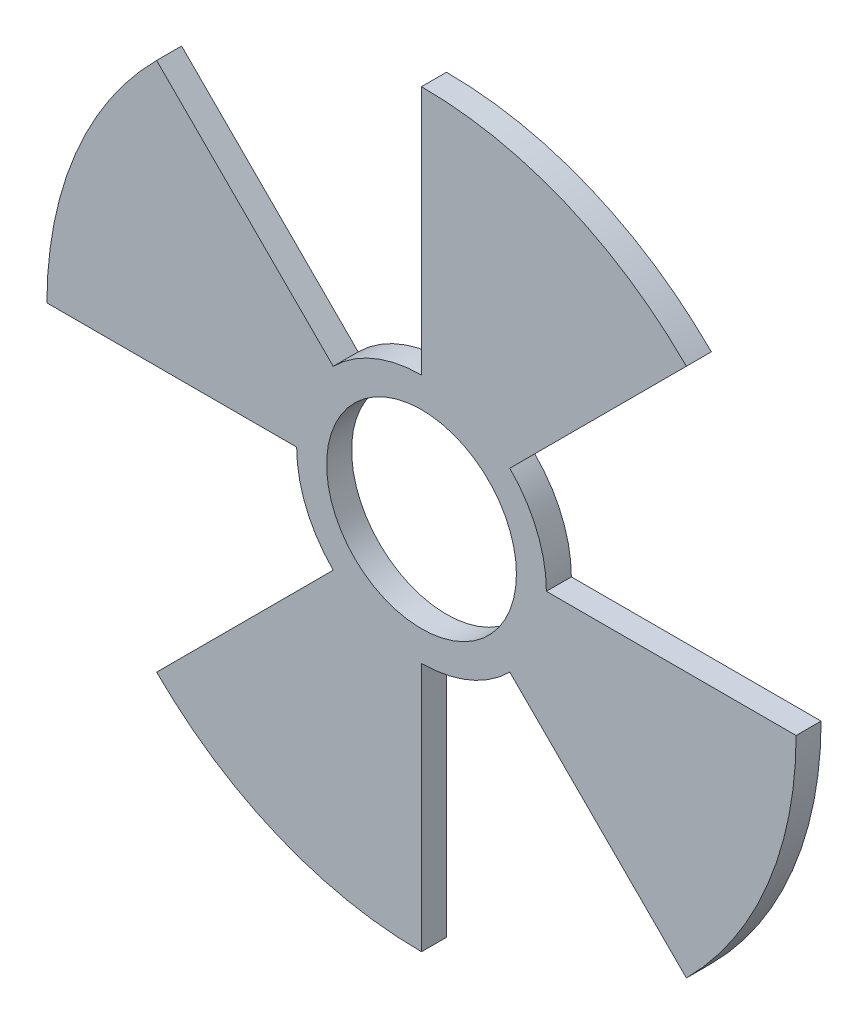
ISO-10303-21;
HEADER;
FILE_DESCRIPTION(('STEP AP214'),'2;1');
FILE_NAME('part.step','',(''),(''),'','','');
FILE_SCHEMA(('AUTOMOTIVE_DESIGN { 1 0 10303 214 1 1 1 1 }'));
ENDSEC;
DATA;
#1=APPLICATION_CONTEXT('core data for automotive mechanical design processes');
#2=APPLICATION_PROTOCOL_DEFINITION('international standard','automotive_design',2000,#1);
#3=PRODUCT_CONTEXT('',#1,'mechanical');
#4=PRODUCT('Part','Part','',(#3));
#5=PRODUCT_RELATED_PRODUCT_CATEGORY('part','',(#4));
#6=PRODUCT_DEFINITION_FORMATION('','',#4);
#7=PRODUCT_DEFINITION_CONTEXT('part definition',#1,'design');
#8=PRODUCT_DEFINITION('design','',#6,#7);
#9=PRODUCT_DEFINITION_SHAPE('','',#8);
#10=(LENGTH_UNIT() NAMED_UNIT(*) SI_UNIT(.MILLI.,.METRE.));
#11=(NAMED_UNIT(*) PLANE_ANGLE_UNIT() SI_UNIT($,.RADIAN.));
#12=(NAMED_UNIT(*) SI_UNIT($,.STERADIAN.) SOLID_ANGLE_UNIT());
#13=UNCERTAINTY_MEASURE_WITH_UNIT(LENGTH_MEASURE(1.E-05),#10,'distance_accuracy_value','');
#14=(GEOMETRIC_REPRESENTATION_CONTEXT(3) GLOBAL_UNCERTAINTY_ASSIGNED_CONTEXT((#13)) GLOBAL_UNIT_ASSIGNED_CONTEXT((#10,
#11,#12)) REPRESENTATION_CONTEXT('',''));
#15=CARTESIAN_POINT('',(0.,0.,0.));
#16=DIRECTION('',(0.,0.,1.));
#17=DIRECTION('',(1.,0.,0.));
#18=AXIS2_PLACEMENT_3D('',#15,#16,#17);
#19=CARTESIAN_POINT('',(0.,0.,2.));
#20=DIRECTION('',(0.,0.,-1.));
#21=DIRECTION('',(-1.,0.,0.));
#22=AXIS2_PLACEMENT_3D('',#19,#20,#21);
#23=CYLINDRICAL_SURFACE('',#22,10.);
#24=CARTESIAN_POINT('',(0.,0.,0.));
#25=DIRECTION('',(0.,0.,1.));
#26=DIRECTION('',(1.,0.,0.));
#27=AXIS2_PLACEMENT_3D('',#24,#25,#26);
#28=CIRCLE('',#27,10.);
#29=CARTESIAN_POINT('',(0.,10.,0.));
#30=VERTEX_POINT('',#29);
#31=CARTESIAN_POINT('',(-7.07106781186544,7.07106781186551,0.));
#32=VERTEX_POINT('',#31);
#33=EDGE_CURVE('E46',#30,#32,#28,.T.);
#34=ORIENTED_EDGE('',*,*,#33,.T.);
#35=DIRECTION('',(0.,0.,1.));
#36=VECTOR('',#35,1.);
#37=CARTESIAN_POINT('',(-7.07106781186544,7.07106781186551,0.));
#38=LINE('',#37,#36);
#39=CARTESIAN_POINT('',(-7.07106781186544,7.07106781186551,2.));
#40=VERTEX_POINT('',#39);
#41=EDGE_CURVE('E67',#32,#40,#38,.T.);
#42=ORIENTED_EDGE('',*,*,#41,.T.);
#43=CARTESIAN_POINT('',(0.,0.,2.));
#44=DIRECTION('',(0.,0.,1.));
#45=DIRECTION('',(1.,0.,0.));
#46=AXIS2_PLACEMENT_3D('',#43,#44,#45);
#47=CIRCLE('',#46,10.);
#48=CARTESIAN_POINT('',(0.,10.,2.));
#49=VERTEX_POINT('',#48);
#50=EDGE_CURVE('E11',#49,#40,#47,.T.);
#51=ORIENTED_EDGE('',*,*,#50,.F.);
#52=DIRECTION('',(0.,0.,1.));
#53=VECTOR('',#52,1.);
#54=CARTESIAN_POINT('',(0.,10.,0.));
#55=LINE('',#54,#53);
#56=EDGE_CURVE('E301',#30,#49,#55,.T.);
#57=ORIENTED_EDGE('',*,*,#56,.F.);
#58=EDGE_LOOP('',(#34,#42,#51,#57));
#59=FACE_BOUND('',#58,.T.);
#60=ADVANCED_FACE('F42',(#59),#23,.T.);
#61=CARTESIAN_POINT('',(-10.,1.63470475981349E-13,2.));
#62=VERTEX_POINT('',#61);
#63=CARTESIAN_POINT('',(-7.07106781186548,-7.07106781186546,2.));
#64=VERTEX_POINT('',#63);
#65=EDGE_CURVE('E52',#62,#64,#47,.T.);
#66=ORIENTED_EDGE('',*,*,#65,.F.);
#67=DIRECTION('',(0.,0.,1.));
#68=VECTOR('',#67,1.);
#69=CARTESIAN_POINT('',(-10.,1.04744440165294E-13,0.));
#70=LINE('',#69,#68);
#71=CARTESIAN_POINT('',(-10.,1.04744440165294E-13,0.));
#72=VERTEX_POINT('',#71);
#73=EDGE_CURVE('E345',#72,#62,#70,.T.);
#74=ORIENTED_EDGE('',*,*,#73,.F.);
#75=CARTESIAN_POINT('',(-7.07106781186548,-7.07106781186546,0.));
#76=VERTEX_POINT('',#75);
#77=EDGE_CURVE('E343',#72,#76,#28,.T.);
#78=ORIENTED_EDGE('',*,*,#77,.T.);
#79=DIRECTION('',(0.,0.,1.));
#80=VECTOR('',#79,1.);
#81=CARTESIAN_POINT('',(-7.07106781186548,-7.07106781186546,0.));
#82=LINE('',#81,#80);
#83=EDGE_CURVE('E206',#76,#64,#82,.T.);
#84=ORIENTED_EDGE('',*,*,#83,.T.);
#85=EDGE_LOOP('',(#66,#74,#78,#84));
#86=FACE_BOUND('',#85,.T.);
#87=ADVANCED_FACE('F334',(#86),#23,.T.);
#88=CARTESIAN_POINT('',(-1.08980317320899E-13,-10.,2.));
#89=VERTEX_POINT('',#88);
#90=CARTESIAN_POINT('',(7.07106781186549,-7.07106781186546,2.));
#91=VERTEX_POINT('',#90);
#92=EDGE_CURVE('E356',#89,#91,#47,.T.);
#93=ORIENTED_EDGE('',*,*,#92,.F.);
#94=DIRECTION('',(0.,0.,1.));
#95=VECTOR('',#94,1.);
#96=CARTESIAN_POINT('',(0.,-10.,0.));
#97=LINE('',#96,#95);
#98=CARTESIAN_POINT('',(0.,-10.,0.));
#99=VERTEX_POINT('',#98);
#100=EDGE_CURVE('E202',#99,#89,#97,.T.);
#101=ORIENTED_EDGE('',*,*,#100,.F.);
#102=CARTESIAN_POINT('',(7.07106781186549,-7.07106781186546,0.));
#103=VERTEX_POINT('',#102);
#104=EDGE_CURVE('E371',#99,#103,#28,.T.);
#105=ORIENTED_EDGE('',*,*,#104,.T.);
#106=DIRECTION('',(0.,0.,1.));
#107=VECTOR('',#106,1.);
#108=CARTESIAN_POINT('',(7.07106781186549,-7.07106781186546,0.));
#109=LINE('',#108,#107);
#110=EDGE_CURVE('E243',#103,#91,#109,.T.);
#111=ORIENTED_EDGE('',*,*,#110,.T.);
#112=EDGE_LOOP('',(#93,#101,#105,#111));
#113=FACE_BOUND('',#112,.T.);
#114=ADVANCED_FACE('F331',(#113),#23,.T.);
#115=CARTESIAN_POINT('',(0.,0.,2.));
#116=DIRECTION('',(0.,0.,1.));
#117=DIRECTION('',(1.,0.,0.));
#118=AXIS2_PLACEMENT_3D('',#115,#116,#117);
#119=PLANE('',#118);
#120=ORIENTED_EDGE('',*,*,#50,.T.);
#121=DIRECTION('',(-0.707106781186544,0.707106781186551,0.));
#122=VECTOR('',#121,1.);
#123=CARTESIAN_POINT('',(-21.2132034355963,21.2132034355965,2.));
#124=LINE('',#123,#122);
#125=CARTESIAN_POINT('',(-21.2132034355963,21.2132034355965,2.));
#126=VERTEX_POINT('',#125);
#127=EDGE_CURVE('E162',#40,#126,#124,.T.);
#128=ORIENTED_EDGE('',*,*,#127,.T.);
#129=CARTESIAN_POINT('',(0.,0.,2.));
#130=DIRECTION('',(0.,0.,1.));
#131=DIRECTION('',(1.,0.,0.));
#132=AXIS2_PLACEMENT_3D('',#129,#130,#131);
#133=CIRCLE('',#132,30.);
#134=CARTESIAN_POINT('',(-30.,3.14233320495882E-13,2.));
#135=VERTEX_POINT('',#134);
#136=EDGE_CURVE('E171',#126,#135,#133,.T.);
#137=ORIENTED_EDGE('',*,*,#136,.T.);
#138=DIRECTION('',(1.,0.,0.));
#139=VECTOR('',#138,1.);
#140=CARTESIAN_POINT('',(-30.,3.14233320495882E-13,2.));
#141=LINE('',#140,#139);
#142=EDGE_CURVE('E179',#135,#62,#141,.T.);
#143=ORIENTED_EDGE('',*,*,#142,.T.);
#144=ORIENTED_EDGE('',*,*,#65,.T.);
#145=DIRECTION('',(-0.707106781186549,-0.707106781186546,0.));
#146=VECTOR('',#145,1.);
#147=CARTESIAN_POINT('',(-21.2132034355965,-21.2132034355964,2.));
#148=LINE('',#147,#146);
#149=CARTESIAN_POINT('',(-21.2132034355965,-21.2132034355964,2.));
#150=VERTEX_POINT('',#149);
#151=EDGE_CURVE('E211',#64,#150,#148,.T.);
#152=ORIENTED_EDGE('',*,*,#151,.T.);
#153=CARTESIAN_POINT('',(0.,0.,2.));
#154=DIRECTION('',(0.,0.,1.));
#155=DIRECTION('',(1.,0.,0.));
#156=AXIS2_PLACEMENT_3D('',#153,#154,#155);
#157=CIRCLE('',#156,30.);
#158=CARTESIAN_POINT('',(-2.09488880330588E-13,-30.,2.));
#159=VERTEX_POINT('',#158);
#160=EDGE_CURVE('E220',#150,#159,#157,.T.);
#161=ORIENTED_EDGE('',*,*,#160,.T.);
#162=DIRECTION('',(0.,1.,0.));
#163=VECTOR('',#162,1.);
#164=CARTESIAN_POINT('',(-2.09488880330588E-13,-30.,2.));
#165=LINE('',#164,#163);
#166=EDGE_CURVE('E215',#159,#89,#165,.T.);
#167=ORIENTED_EDGE('',*,*,#166,.T.);
#168=ORIENTED_EDGE('',*,*,#92,.T.);
#169=DIRECTION('',(0.707106781186549,-0.707106781186546,0.));
#170=VECTOR('',#169,1.);
#171=CARTESIAN_POINT('',(21.2132034355965,-21.2132034355964,2.));
#172=LINE('',#171,#170);
#173=CARTESIAN_POINT('',(21.2132034355965,-21.2132034355964,2.));
#174=VERTEX_POINT('',#173);
#175=EDGE_CURVE('E249',#91,#174,#172,.T.);
#176=ORIENTED_EDGE('',*,*,#175,.T.);
#177=CARTESIAN_POINT('',(0.,0.,2.));
#178=DIRECTION('',(0.,0.,1.));
#179=DIRECTION('',(1.,0.,0.));
#180=AXIS2_PLACEMENT_3D('',#177,#178,#179);
#181=CIRCLE('',#180,30.);
#182=CARTESIAN_POINT('',(30.,-1.04744440165294E-13,2.));
#183=VERTEX_POINT('',#182);
#184=EDGE_CURVE('E257',#174,#183,#181,.T.);
#185=ORIENTED_EDGE('',*,*,#184,.T.);
#186=DIRECTION('',(-1.,0.,0.));
#187=VECTOR('',#186,1.);
#188=CARTESIAN_POINT('',(30.,-1.04744440165294E-13,2.));
#189=LINE('',#188,#187);
#190=CARTESIAN_POINT('',(10.,0.,2.));
#191=VERTEX_POINT('',#190);
#192=EDGE_CURVE('E253',#183,#191,#189,.T.);
#193=ORIENTED_EDGE('',*,*,#192,.T.);
#194=CARTESIAN_POINT('',(7.07106781186543,7.07106781186551,2.));
#195=VERTEX_POINT('',#194);
#196=EDGE_CURVE('E53',#191,#195,#47,.T.);
#197=ORIENTED_EDGE('',*,*,#196,.T.);
#198=DIRECTION('',(0.707106781186544,0.707106781186551,0.));
#199=VECTOR('',#198,1.);
#200=CARTESIAN_POINT('',(21.2132034355963,21.2132034355965,2.));
#201=LINE('',#200,#199);
#202=CARTESIAN_POINT('',(21.2132034355963,21.2132034355965,2.));
#203=VERTEX_POINT('',#202);
#204=EDGE_CURVE('E276',#195,#203,#201,.T.);
#205=ORIENTED_EDGE('',*,*,#204,.T.);
#206=CARTESIAN_POINT('',(0.,0.,2.));
#207=DIRECTION('',(0.,0.,1.));
#208=DIRECTION('',(1.,0.,0.));
#209=AXIS2_PLACEMENT_3D('',#206,#207,#208);
#210=CIRCLE('',#209,30.);
#211=CARTESIAN_POINT('',(0.,30.,2.));
#212=VERTEX_POINT('',#211);
#213=EDGE_CURVE('E261',#203,#212,#210,.T.);
#214=ORIENTED_EDGE('',*,*,#213,.T.);
#215=DIRECTION('',(0.,-1.,0.));
#216=VECTOR('',#215,1.);
#217=CARTESIAN_POINT('',(0.,30.,2.));
#218=LINE('',#217,#216);
#219=EDGE_CURVE('E287',#212,#49,#218,.T.);
#220=ORIENTED_EDGE('',*,*,#219,.T.);
#221=EDGE_LOOP('',(#120,#128,#137,#143,#144,#152,#161,#167,#168,#176,#185,#193,#197,#205,#214,#220));
#222=FACE_BOUND('',#221,.T.);
#223=CARTESIAN_POINT('',(0.,0.,2.));
#224=DIRECTION('',(0.,0.,1.));
#225=DIRECTION('',(1.,0.,0.));
#226=AXIS2_PLACEMENT_3D('',#223,#224,#225);
#227=CIRCLE('',#226,7.6);
#228=CARTESIAN_POINT('',(7.6,0.,2.));
#229=VERTEX_POINT('',#228);
#230=EDGE_CURVE('E307',#229,#229,#227,.T.);
#231=ORIENTED_EDGE('',*,*,#230,.F.);
#232=EDGE_LOOP('',(#231));
#233=FACE_BOUND('',#232,.T.);
#234=ADVANCED_FACE('F181',(#222,#233),#119,.T.);
#235=CARTESIAN_POINT('',(0.,0.,0.));
#236=DIRECTION('',(0.,0.,1.));
#237=DIRECTION('',(1.,0.,0.));
#238=AXIS2_PLACEMENT_3D('',#235,#236,#237);
#239=PLANE('',#238);
#240=ORIENTED_EDGE('',*,*,#33,.F.);
#241=DIRECTION('',(0.,-1.,0.));
#242=VECTOR('',#241,1.);
#243=CARTESIAN_POINT('',(0.,30.,0.));
#244=LINE('',#243,#242);
#245=CARTESIAN_POINT('',(0.,30.,0.));
#246=VERTEX_POINT('',#245);
#247=EDGE_CURVE('E275',#246,#30,#244,.T.);
#248=ORIENTED_EDGE('',*,*,#247,.F.);
#249=CARTESIAN_POINT('',(0.,0.,0.));
#250=DIRECTION('',(0.,0.,1.));
#251=DIRECTION('',(1.,0.,0.));
#252=AXIS2_PLACEMENT_3D('',#249,#250,#251);
#253=CIRCLE('',#252,30.);
#254=CARTESIAN_POINT('',(21.2132034355963,21.2132034355965,0.));
#255=VERTEX_POINT('',#254);
#256=EDGE_CURVE('E271',#255,#246,#253,.T.);
#257=ORIENTED_EDGE('',*,*,#256,.F.);
#258=DIRECTION('',(0.707106781186544,0.707106781186551,0.));
#259=VECTOR('',#258,1.);
#260=CARTESIAN_POINT('',(21.2132034355963,21.2132034355965,0.));
#261=LINE('',#260,#259);
#262=CARTESIAN_POINT('',(7.07106781186543,7.07106781186551,0.));
#263=VERTEX_POINT('',#262);
#264=EDGE_CURVE('E279',#263,#255,#261,.T.);
#265=ORIENTED_EDGE('',*,*,#264,.F.);
#266=CARTESIAN_POINT('',(10.,0.,0.));
#267=VERTEX_POINT('',#266);
#268=EDGE_CURVE('E311',#267,#263,#28,.T.);
#269=ORIENTED_EDGE('',*,*,#268,.F.);
#270=DIRECTION('',(-1.,0.,0.));
#271=VECTOR('',#270,1.);
#272=CARTESIAN_POINT('',(30.,-1.04744440165294E-13,0.));
#273=LINE('',#272,#271);
#274=CARTESIAN_POINT('',(30.,-1.04744440165294E-13,0.));
#275=VERTEX_POINT('',#274);
#276=EDGE_CURVE('E265',#275,#267,#273,.T.);
#277=ORIENTED_EDGE('',*,*,#276,.F.);
#278=CARTESIAN_POINT('',(0.,0.,0.));
#279=DIRECTION('',(0.,0.,1.));
#280=DIRECTION('',(1.,0.,0.));
#281=AXIS2_PLACEMENT_3D('',#278,#279,#280);
#282=CIRCLE('',#281,30.);
#283=CARTESIAN_POINT('',(21.2132034355965,-21.2132034355964,0.));
#284=VERTEX_POINT('',#283);
#285=EDGE_CURVE('E254',#284,#275,#282,.T.);
#286=ORIENTED_EDGE('',*,*,#285,.F.);
#287=DIRECTION('',(0.707106781186549,-0.707106781186546,0.));
#288=VECTOR('',#287,1.);
#289=CARTESIAN_POINT('',(21.2132034355965,-21.2132034355964,0.));
#290=LINE('',#289,#288);
#291=EDGE_CURVE('E238',#103,#284,#290,.T.);
#292=ORIENTED_EDGE('',*,*,#291,.F.);
#293=ORIENTED_EDGE('',*,*,#104,.F.);
#294=DIRECTION('',(0.,1.,0.));
#295=VECTOR('',#294,1.);
#296=CARTESIAN_POINT('',(-2.09488880330588E-13,-30.,0.));
#297=LINE('',#296,#295);
#298=CARTESIAN_POINT('',(-2.09488880330588E-13,-30.,0.));
#299=VERTEX_POINT('',#298);
#300=EDGE_CURVE('E228',#299,#99,#297,.T.);
#301=ORIENTED_EDGE('',*,*,#300,.F.);
#302=CARTESIAN_POINT('',(0.,0.,0.));
#303=DIRECTION('',(0.,0.,1.));
#304=DIRECTION('',(1.,0.,0.));
#305=AXIS2_PLACEMENT_3D('',#302,#303,#304);
#306=CIRCLE('',#305,30.);
#307=CARTESIAN_POINT('',(-21.2132034355965,-21.2132034355964,0.));
#308=VERTEX_POINT('',#307);
#309=EDGE_CURVE('E216',#308,#299,#306,.T.);
#310=ORIENTED_EDGE('',*,*,#309,.F.);
#311=DIRECTION('',(-0.707106781186549,-0.707106781186546,0.));
#312=VECTOR('',#311,1.);
#313=CARTESIAN_POINT('',(-21.2132034355965,-21.2132034355964,0.));
#314=LINE('',#313,#312);
#315=EDGE_CURVE('E201',#76,#308,#314,.T.);
#316=ORIENTED_EDGE('',*,*,#315,.F.);
#317=ORIENTED_EDGE('',*,*,#77,.F.);
#318=DIRECTION('',(1.,0.,0.));
#319=VECTOR('',#318,1.);
#320=CARTESIAN_POINT('',(-30.,3.14233320495882E-13,0.));
#321=LINE('',#320,#319);
#322=CARTESIAN_POINT('',(-30.,3.14233320495882E-13,0.));
#323=VERTEX_POINT('',#322);
#324=EDGE_CURVE('E189',#323,#72,#321,.T.);
#325=ORIENTED_EDGE('',*,*,#324,.F.);
#326=CARTESIAN_POINT('',(0.,0.,0.));
#327=DIRECTION('',(0.,0.,1.));
#328=DIRECTION('',(1.,0.,0.));
#329=AXIS2_PLACEMENT_3D('',#326,#327,#328);
#330=CIRCLE('',#329,30.);
#331=CARTESIAN_POINT('',(-21.2132034355963,21.2132034355965,0.));
#332=VERTEX_POINT('',#331);
#333=EDGE_CURVE('E184',#332,#323,#330,.T.);
#334=ORIENTED_EDGE('',*,*,#333,.F.);
#335=DIRECTION('',(-0.707106781186544,0.707106781186551,0.));
#336=VECTOR('',#335,1.);
#337=CARTESIAN_POINT('',(-21.2132034355963,21.2132034355965,0.));
#338=LINE('',#337,#336);
#339=EDGE_CURVE('E164',#32,#332,#338,.T.);
#340=ORIENTED_EDGE('',*,*,#339,.F.);
#341=EDGE_LOOP('',(#240,#248,#257,#265,#269,#277,#286,#292,#293,#301,#310,#316,#317,#325,#334,#340));
#342=FACE_BOUND('',#341,.T.);
#343=CARTESIAN_POINT('',(0.,0.,0.));
#344=DIRECTION('',(0.,0.,1.));
#345=DIRECTION('',(1.,0.,0.));
#346=AXIS2_PLACEMENT_3D('',#343,#344,#345);
#347=CIRCLE('',#346,7.6);
#348=CARTESIAN_POINT('',(7.6,0.,0.));
#349=VERTEX_POINT('',#348);
#350=EDGE_CURVE('E296',#349,#349,#347,.T.);
#351=ORIENTED_EDGE('',*,*,#350,.T.);
#352=EDGE_LOOP('',(#351));
#353=FACE_BOUND('',#352,.T.);
#354=ADVANCED_FACE('F316',(#342,#353),#239,.F.);
#355=ORIENTED_EDGE('',*,*,#196,.F.);
#356=DIRECTION('',(0.,0.,1.));
#357=VECTOR('',#356,1.);
#358=CARTESIAN_POINT('',(10.,0.,0.));
#359=LINE('',#358,#357);
#360=EDGE_CURVE('E239',#267,#191,#359,.T.);
#361=ORIENTED_EDGE('',*,*,#360,.F.);
#362=ORIENTED_EDGE('',*,*,#268,.T.);
#363=DIRECTION('',(0.,0.,1.));
#364=VECTOR('',#363,1.);
#365=CARTESIAN_POINT('',(7.07106781186543,7.07106781186551,0.));
#366=LINE('',#365,#364);
#367=EDGE_CURVE('E297',#263,#195,#366,.T.);
#368=ORIENTED_EDGE('',*,*,#367,.T.);
#369=EDGE_LOOP('',(#355,#361,#362,#368));
#370=FACE_BOUND('',#369,.T.);
#371=ADVANCED_FACE('F44',(#370),#23,.T.);
#372=CARTESIAN_POINT('',(0.,0.,2.));
#373=DIRECTION('',(0.,0.,-1.));
#374=DIRECTION('',(-1.,0.,0.));
#375=AXIS2_PLACEMENT_3D('',#372,#373,#374);
#376=CYLINDRICAL_SURFACE('',#375,7.6);
#377=ORIENTED_EDGE('',*,*,#230,.T.);
#378=EDGE_LOOP('',(#377));
#379=FACE_BOUND('',#378,.T.);
#380=ORIENTED_EDGE('',*,*,#350,.F.);
#381=EDGE_LOOP('',(#380));
#382=FACE_BOUND('',#381,.T.);
#383=ADVANCED_FACE('F318',(#379,#382),#376,.F.);
#384=CARTESIAN_POINT('',(0.,0.,0.));
#385=DIRECTION('',(0.,0.,1.));
#386=DIRECTION('',(1.,0.,0.));
#387=AXIS2_PLACEMENT_3D('',#384,#385,#386);
#388=CYLINDRICAL_SURFACE('',#387,30.);
#389=ORIENTED_EDGE('',*,*,#213,.F.);
#390=DIRECTION('',(0.,0.,1.));
#391=VECTOR('',#390,1.);
#392=CARTESIAN_POINT('',(21.2132034355963,21.2132034355965,0.));
#393=LINE('',#392,#391);
#394=EDGE_CURVE('E293',#255,#203,#393,.T.);
#395=ORIENTED_EDGE('',*,*,#394,.F.);
#396=ORIENTED_EDGE('',*,*,#256,.T.);
#397=DIRECTION('',(0.,0.,1.));
#398=VECTOR('',#397,1.);
#399=CARTESIAN_POINT('',(0.,30.,0.));
#400=LINE('',#399,#398);
#401=EDGE_CURVE('E283',#246,#212,#400,.T.);
#402=ORIENTED_EDGE('',*,*,#401,.T.);
#403=EDGE_LOOP('',(#389,#395,#396,#402));
#404=FACE_BOUND('',#403,.T.);
#405=ADVANCED_FACE('F320',(#404),#388,.T.);
#406=CARTESIAN_POINT('',(21.2132034355963,21.2132034355965,0.));
#407=DIRECTION('',(0.707106781186551,-0.707106781186544,0.));
#408=DIRECTION('',(0.707106781186544,0.707106781186551,0.));
#409=AXIS2_PLACEMENT_3D('',#406,#407,#408);
#410=PLANE('',#409);
#411=ORIENTED_EDGE('',*,*,#204,.F.);
#412=ORIENTED_EDGE('',*,*,#367,.F.);
#413=ORIENTED_EDGE('',*,*,#264,.T.);
#414=ORIENTED_EDGE('',*,*,#394,.T.);
#415=EDGE_LOOP('',(#411,#412,#413,#414));
#416=FACE_BOUND('',#415,.T.);
#417=ADVANCED_FACE('F327',(#416),#410,.T.);
#418=CARTESIAN_POINT('',(0.,30.,0.));
#419=DIRECTION('',(-1.,0.,0.));
#420=DIRECTION('',(0.,0.,1.));
#421=AXIS2_PLACEMENT_3D('',#418,#419,#420);
#422=PLANE('',#421);
#423=ORIENTED_EDGE('',*,*,#219,.F.);
#424=ORIENTED_EDGE('',*,*,#401,.F.);
#425=ORIENTED_EDGE('',*,*,#247,.T.);
#426=ORIENTED_EDGE('',*,*,#56,.T.);
#427=EDGE_LOOP('',(#423,#424,#425,#426));
#428=FACE_BOUND('',#427,.T.);
#429=ADVANCED_FACE('F392',(#428),#422,.T.);
#430=CARTESIAN_POINT('',(0.,0.,0.));
#431=DIRECTION('',(0.,0.,1.));
#432=DIRECTION('',(1.,0.,0.));
#433=AXIS2_PLACEMENT_3D('',#430,#431,#432);
#434=CYLINDRICAL_SURFACE('',#433,30.);
#435=ORIENTED_EDGE('',*,*,#184,.F.);
#436=DIRECTION('',(0.,0.,1.));
#437=VECTOR('',#436,1.);
#438=CARTESIAN_POINT('',(21.2132034355965,-21.2132034355964,0.));
#439=LINE('',#438,#437);
#440=EDGE_CURVE('E224',#284,#174,#439,.T.);
#441=ORIENTED_EDGE('',*,*,#440,.F.);
#442=ORIENTED_EDGE('',*,*,#285,.T.);
#443=DIRECTION('',(0.,0.,1.));
#444=VECTOR('',#443,1.);
#445=CARTESIAN_POINT('',(30.,-1.04744440165294E-13,0.));
#446=LINE('',#445,#444);
#447=EDGE_CURVE('E235',#275,#183,#446,.T.);
#448=ORIENTED_EDGE('',*,*,#447,.T.);
#449=EDGE_LOOP('',(#435,#441,#442,#448));
#450=FACE_BOUND('',#449,.T.);
#451=ADVANCED_FACE('F394',(#450),#434,.T.);
#452=CARTESIAN_POINT('',(21.2132034355965,-21.2132034355964,0.));
#453=DIRECTION('',(-0.707106781186546,-0.707106781186549,0.));
#454=DIRECTION('',(0.707106781186549,-0.707106781186546,0.));
#455=AXIS2_PLACEMENT_3D('',#452,#453,#454);
#456=PLANE('',#455);
#457=ORIENTED_EDGE('',*,*,#175,.F.);
#458=ORIENTED_EDGE('',*,*,#110,.F.);
#459=ORIENTED_EDGE('',*,*,#291,.T.);
#460=ORIENTED_EDGE('',*,*,#440,.T.);
#461=EDGE_LOOP('',(#457,#458,#459,#460));
#462=FACE_BOUND('',#461,.T.);
#463=ADVANCED_FACE('F400',(#462),#456,.T.);
#464=CARTESIAN_POINT('',(30.,-1.04744440165294E-13,0.));
#465=DIRECTION('',(0.,1.,0.));
#466=DIRECTION('',(-1.,0.,0.));
#467=AXIS2_PLACEMENT_3D('',#464,#465,#466);
#468=PLANE('',#467);
#469=ORIENTED_EDGE('',*,*,#192,.F.);
#470=ORIENTED_EDGE('',*,*,#447,.F.);
#471=ORIENTED_EDGE('',*,*,#276,.T.);
#472=ORIENTED_EDGE('',*,*,#360,.T.);
#473=EDGE_LOOP('',(#469,#470,#471,#472));
#474=FACE_BOUND('',#473,.T.);
#475=ADVANCED_FACE('F407',(#474),#468,.T.);
#476=CARTESIAN_POINT('',(0.,0.,0.));
#477=DIRECTION('',(0.,0.,1.));
#478=DIRECTION('',(1.,0.,0.));
#479=AXIS2_PLACEMENT_3D('',#476,#477,#478);
#480=CYLINDRICAL_SURFACE('',#479,30.);
#481=ORIENTED_EDGE('',*,*,#160,.F.);
#482=DIRECTION('',(0.,0.,1.));
#483=VECTOR('',#482,1.);
#484=CARTESIAN_POINT('',(-21.2132034355965,-21.2132034355964,0.));
#485=LINE('',#484,#483);
#486=EDGE_CURVE('E178',#308,#150,#485,.T.);
#487=ORIENTED_EDGE('',*,*,#486,.F.);
#488=ORIENTED_EDGE('',*,*,#309,.T.);
#489=DIRECTION('',(0.,0.,1.));
#490=VECTOR('',#489,1.);
#491=CARTESIAN_POINT('',(-2.09488880330588E-13,-30.,0.));
#492=LINE('',#491,#490);
#493=EDGE_CURVE('E198',#299,#159,#492,.T.);
#494=ORIENTED_EDGE('',*,*,#493,.T.);
#495=EDGE_LOOP('',(#481,#487,#488,#494));
#496=FACE_BOUND('',#495,.T.);
#497=ADVANCED_FACE('F363',(#496),#480,.T.);
#498=CARTESIAN_POINT('',(-21.2132034355965,-21.2132034355964,0.));
#499=DIRECTION('',(-0.707106781186546,0.707106781186549,0.));
#500=DIRECTION('',(-0.707106781186549,-0.707106781186546,0.));
#501=AXIS2_PLACEMENT_3D('',#498,#499,#500);
#502=PLANE('',#501);
#503=ORIENTED_EDGE('',*,*,#151,.F.);
#504=ORIENTED_EDGE('',*,*,#83,.F.);
#505=ORIENTED_EDGE('',*,*,#315,.T.);
#506=ORIENTED_EDGE('',*,*,#486,.T.);
#507=EDGE_LOOP('',(#503,#504,#505,#506));
#508=FACE_BOUND('',#507,.T.);
#509=ADVANCED_FACE('F359',(#508),#502,.T.);
#510=CARTESIAN_POINT('',(-2.09488880330588E-13,-30.,0.));
#511=DIRECTION('',(1.,0.,0.));
#512=DIRECTION('',(0.,1.,0.));
#513=AXIS2_PLACEMENT_3D('',#510,#511,#512);
#514=PLANE('',#513);
#515=ORIENTED_EDGE('',*,*,#166,.F.);
#516=ORIENTED_EDGE('',*,*,#493,.F.);
#517=ORIENTED_EDGE('',*,*,#300,.T.);
#518=ORIENTED_EDGE('',*,*,#100,.T.);
#519=EDGE_LOOP('',(#515,#516,#517,#518));
#520=FACE_BOUND('',#519,.T.);
#521=ADVANCED_FACE('F367',(#520),#514,.T.);
#522=CARTESIAN_POINT('',(0.,0.,0.));
#523=DIRECTION('',(0.,0.,1.));
#524=DIRECTION('',(1.,0.,0.));
#525=AXIS2_PLACEMENT_3D('',#522,#523,#524);
#526=CYLINDRICAL_SURFACE('',#525,30.);
#527=ORIENTED_EDGE('',*,*,#136,.F.);
#528=DIRECTION('',(0.,0.,1.));
#529=VECTOR('',#528,1.);
#530=CARTESIAN_POINT('',(-21.2132034355963,21.2132034355965,0.));
#531=LINE('',#530,#529);
#532=EDGE_CURVE('E158',#332,#126,#531,.T.);
#533=ORIENTED_EDGE('',*,*,#532,.F.);
#534=ORIENTED_EDGE('',*,*,#333,.T.);
#535=DIRECTION('',(0.,0.,1.));
#536=VECTOR('',#535,1.);
#537=CARTESIAN_POINT('',(-30.,3.14233320495882E-13,0.));
#538=LINE('',#537,#536);
#539=EDGE_CURVE('E173',#323,#135,#538,.T.);
#540=ORIENTED_EDGE('',*,*,#539,.T.);
#541=EDGE_LOOP('',(#527,#533,#534,#540));
#542=FACE_BOUND('',#541,.T.);
#543=ADVANCED_FACE('F172',(#542),#526,.T.);
#544=CARTESIAN_POINT('',(-21.2132034355963,21.2132034355965,0.));
#545=DIRECTION('',(0.707106781186551,0.707106781186544,0.));
#546=DIRECTION('',(-0.707106781186544,0.707106781186551,0.));
#547=AXIS2_PLACEMENT_3D('',#544,#545,#546);
#548=PLANE('',#547);
#549=ORIENTED_EDGE('',*,*,#127,.F.);
#550=ORIENTED_EDGE('',*,*,#41,.F.);
#551=ORIENTED_EDGE('',*,*,#339,.T.);
#552=ORIENTED_EDGE('',*,*,#532,.T.);
#553=EDGE_LOOP('',(#549,#550,#551,#552));
#554=FACE_BOUND('',#553,.T.);
#555=ADVANCED_FACE('F160',(#554),#548,.T.);
#556=CARTESIAN_POINT('',(-30.,3.14233320495882E-13,0.));
#557=DIRECTION('',(0.,-1.,0.));
#558=DIRECTION('',(1.,0.,0.));
#559=AXIS2_PLACEMENT_3D('',#556,#557,#558);
#560=PLANE('',#559);
#561=ORIENTED_EDGE('',*,*,#142,.F.);
#562=ORIENTED_EDGE('',*,*,#539,.F.);
#563=ORIENTED_EDGE('',*,*,#324,.T.);
#564=ORIENTED_EDGE('',*,*,#73,.T.);
#565=EDGE_LOOP('',(#561,#562,#563,#564));
#566=FACE_BOUND('',#565,.T.);
#567=ADVANCED_FACE('F349',(#566),#560,.T.);
#568=CLOSED_SHELL('',(#60,#87,#114,#234,#354,#371,#383,#405,#417,#429,#451,#463,#475,#497,#509,
#521,#543,#555,#567));
#569=MANIFOLD_SOLID_BREP('B2',#568);
#570=ADVANCED_BREP_SHAPE_REPRESENTATION('',(#18,#569),#14);
#571=SHAPE_DEFINITION_REPRESENTATION(#9,#570);
ENDSEC;
END-ISO-10303-21;
